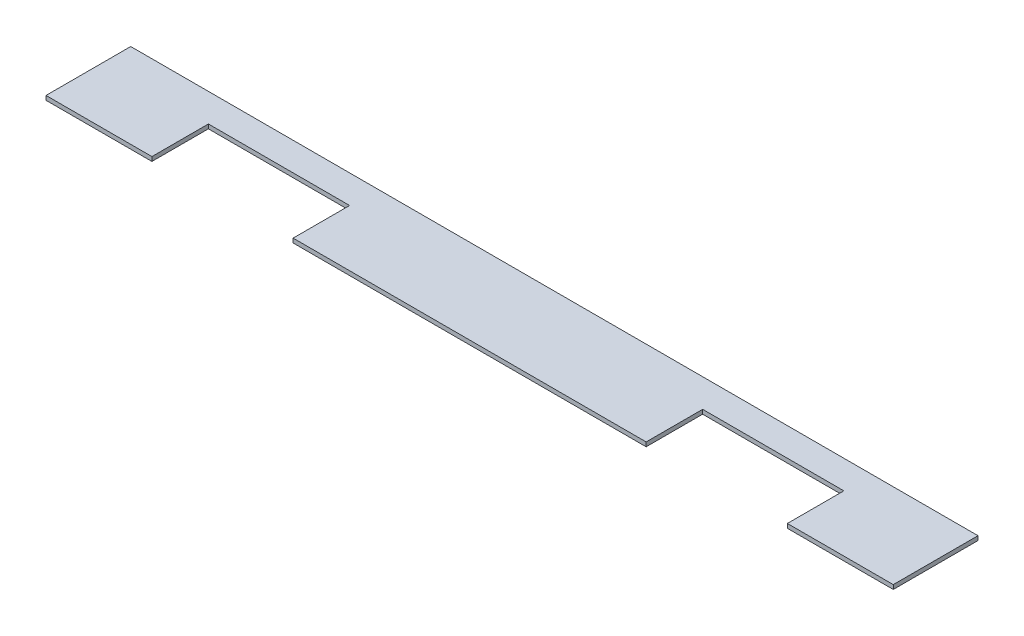
ISO-10303-21;
HEADER;
FILE_DESCRIPTION(('STEP AP214'),'2;1');
FILE_NAME('part.step','',(''),(''),'','','');
FILE_SCHEMA(('AUTOMOTIVE_DESIGN { 1 0 10303 214 1 1 1 1 }'));
ENDSEC;
DATA;
#1=APPLICATION_CONTEXT('core data for automotive mechanical design processes');
#2=APPLICATION_PROTOCOL_DEFINITION('international standard','automotive_design',2000,#1);
#3=PRODUCT_CONTEXT('',#1,'mechanical');
#4=PRODUCT('Part','Part','',(#3));
#5=PRODUCT_RELATED_PRODUCT_CATEGORY('part','',(#4));
#6=PRODUCT_DEFINITION_FORMATION('','',#4);
#7=PRODUCT_DEFINITION_CONTEXT('part definition',#1,'design');
#8=PRODUCT_DEFINITION('design','',#6,#7);
#9=PRODUCT_DEFINITION_SHAPE('','',#8);
#10=(LENGTH_UNIT() NAMED_UNIT(*) SI_UNIT(.MILLI.,.METRE.));
#11=(NAMED_UNIT(*) PLANE_ANGLE_UNIT() SI_UNIT($,.RADIAN.));
#12=(NAMED_UNIT(*) SI_UNIT($,.STERADIAN.) SOLID_ANGLE_UNIT());
#13=UNCERTAINTY_MEASURE_WITH_UNIT(LENGTH_MEASURE(1.E-05),#10,'distance_accuracy_value','');
#14=(GEOMETRIC_REPRESENTATION_CONTEXT(3) GLOBAL_UNCERTAINTY_ASSIGNED_CONTEXT((#13)) GLOBAL_UNIT_ASSIGNED_CONTEXT((#10,
#11,#12)) REPRESENTATION_CONTEXT('',''));
#15=CARTESIAN_POINT('',(0.,0.,0.));
#16=DIRECTION('',(0.,0.,1.));
#17=DIRECTION('',(1.,0.,0.));
#18=AXIS2_PLACEMENT_3D('',#15,#16,#17);
#19=CARTESIAN_POINT('',(-300.,3.,30.));
#20=DIRECTION('',(0.,0.,-1.));
#21=DIRECTION('',(-1.,0.,0.));
#22=AXIS2_PLACEMENT_3D('',#19,#20,#21);
#23=PLANE('',#22);
#24=DIRECTION('',(1.,0.,0.));
#25=VECTOR('',#24,1.);
#26=CARTESIAN_POINT('',(-300.,0.,30.));
#27=LINE('',#26,#25);
#28=CARTESIAN_POINT('',(-300.,0.,30.));
#29=VERTEX_POINT('',#28);
#30=CARTESIAN_POINT('',(-225.,0.,30.));
#31=VERTEX_POINT('',#30);
#32=EDGE_CURVE('E140',#29,#31,#27,.T.);
#33=ORIENTED_EDGE('',*,*,#32,.T.);
#34=DIRECTION('',(0.,1.,0.));
#35=VECTOR('',#34,1.);
#36=CARTESIAN_POINT('',(-225.,-7.,30.));
#37=LINE('',#36,#35);
#38=CARTESIAN_POINT('',(-225.,3.,30.));
#39=VERTEX_POINT('',#38);
#40=EDGE_CURVE('E124',#31,#39,#37,.T.);
#41=ORIENTED_EDGE('',*,*,#40,.T.);
#42=DIRECTION('',(1.,0.,0.));
#43=VECTOR('',#42,1.);
#44=CARTESIAN_POINT('',(-300.,3.,30.));
#45=LINE('',#44,#43);
#46=CARTESIAN_POINT('',(-300.,3.,30.));
#47=VERTEX_POINT('',#46);
#48=EDGE_CURVE('E138',#47,#39,#45,.T.);
#49=ORIENTED_EDGE('',*,*,#48,.F.);
#50=DIRECTION('',(0.,-1.,0.));
#51=VECTOR('',#50,1.);
#52=CARTESIAN_POINT('',(-300.,3.,30.));
#53=LINE('',#52,#51);
#54=EDGE_CURVE('E153',#47,#29,#53,.T.);
#55=ORIENTED_EDGE('',*,*,#54,.T.);
#56=EDGE_LOOP('',(#33,#41,#49,#55));
#57=FACE_BOUND('',#56,.T.);
#58=ADVANCED_FACE('F33',(#57),#23,.F.);
#59=CARTESIAN_POINT('',(-125.,3.,30.));
#60=VERTEX_POINT('',#59);
#61=CARTESIAN_POINT('',(125.,3.,30.));
#62=VERTEX_POINT('',#61);
#63=EDGE_CURVE('E149',#60,#62,#45,.T.);
#64=ORIENTED_EDGE('',*,*,#63,.F.);
#65=DIRECTION('',(0.,1.,0.));
#66=VECTOR('',#65,1.);
#67=CARTESIAN_POINT('',(-125.,-7.,30.));
#68=LINE('',#67,#66);
#69=CARTESIAN_POINT('',(-125.,0.,30.));
#70=VERTEX_POINT('',#69);
#71=EDGE_CURVE('E141',#70,#60,#68,.T.);
#72=ORIENTED_EDGE('',*,*,#71,.F.);
#73=CARTESIAN_POINT('',(125.,0.,30.));
#74=VERTEX_POINT('',#73);
#75=EDGE_CURVE('E200',#70,#74,#27,.T.);
#76=ORIENTED_EDGE('',*,*,#75,.T.);
#77=DIRECTION('',(0.,1.,0.));
#78=VECTOR('',#77,1.);
#79=CARTESIAN_POINT('',(125.,-7.,30.));
#80=LINE('',#79,#78);
#81=EDGE_CURVE('E167',#74,#62,#80,.T.);
#82=ORIENTED_EDGE('',*,*,#81,.T.);
#83=EDGE_LOOP('',(#64,#72,#76,#82));
#84=FACE_BOUND('',#83,.T.);
#85=ADVANCED_FACE('F244',(#84),#23,.F.);
#86=CARTESIAN_POINT('',(300.,3.,-30.));
#87=DIRECTION('',(-1.,0.,0.));
#88=DIRECTION('',(0.,0.,1.));
#89=AXIS2_PLACEMENT_3D('',#86,#87,#88);
#90=PLANE('',#89);
#91=DIRECTION('',(0.,0.,-1.));
#92=VECTOR('',#91,1.);
#93=CARTESIAN_POINT('',(300.,0.,-30.));
#94=LINE('',#93,#92);
#95=CARTESIAN_POINT('',(300.,0.,30.));
#96=VERTEX_POINT('',#95);
#97=CARTESIAN_POINT('',(300.,0.,-30.));
#98=VERTEX_POINT('',#97);
#99=EDGE_CURVE('E184',#96,#98,#94,.T.);
#100=ORIENTED_EDGE('',*,*,#99,.T.);
#101=DIRECTION('',(0.,-1.,0.));
#102=VECTOR('',#101,1.);
#103=CARTESIAN_POINT('',(300.,3.,-30.));
#104=LINE('',#103,#102);
#105=CARTESIAN_POINT('',(300.,3.,-30.));
#106=VERTEX_POINT('',#105);
#107=EDGE_CURVE('E211',#106,#98,#104,.T.);
#108=ORIENTED_EDGE('',*,*,#107,.F.);
#109=DIRECTION('',(0.,0.,-1.));
#110=VECTOR('',#109,1.);
#111=CARTESIAN_POINT('',(300.,3.,-30.));
#112=LINE('',#111,#110);
#113=CARTESIAN_POINT('',(300.,3.,30.));
#114=VERTEX_POINT('',#113);
#115=EDGE_CURVE('E163',#114,#106,#112,.T.);
#116=ORIENTED_EDGE('',*,*,#115,.F.);
#117=DIRECTION('',(0.,-1.,0.));
#118=VECTOR('',#117,1.);
#119=CARTESIAN_POINT('',(300.,3.,30.));
#120=LINE('',#119,#118);
#121=EDGE_CURVE('E148',#114,#96,#120,.T.);
#122=ORIENTED_EDGE('',*,*,#121,.T.);
#123=EDGE_LOOP('',(#100,#108,#116,#122));
#124=FACE_BOUND('',#123,.T.);
#125=ADVANCED_FACE('F35',(#124),#90,.F.);
#126=CARTESIAN_POINT('',(-300.,3.,-30.));
#127=DIRECTION('',(0.,0.,1.));
#128=DIRECTION('',(1.,0.,0.));
#129=AXIS2_PLACEMENT_3D('',#126,#127,#128);
#130=PLANE('',#129);
#131=DIRECTION('',(-1.,0.,0.));
#132=VECTOR('',#131,1.);
#133=CARTESIAN_POINT('',(-300.,0.,-30.));
#134=LINE('',#133,#132);
#135=CARTESIAN_POINT('',(-300.,0.,-30.));
#136=VERTEX_POINT('',#135);
#137=EDGE_CURVE('E222',#98,#136,#134,.T.);
#138=ORIENTED_EDGE('',*,*,#137,.T.);
#139=DIRECTION('',(0.,-1.,0.));
#140=VECTOR('',#139,1.);
#141=CARTESIAN_POINT('',(-300.,3.,-30.));
#142=LINE('',#141,#140);
#143=CARTESIAN_POINT('',(-300.,3.,-30.));
#144=VERTEX_POINT('',#143);
#145=EDGE_CURVE('E214',#144,#136,#142,.T.);
#146=ORIENTED_EDGE('',*,*,#145,.F.);
#147=DIRECTION('',(-1.,0.,0.));
#148=VECTOR('',#147,1.);
#149=CARTESIAN_POINT('',(-300.,3.,-30.));
#150=LINE('',#149,#148);
#151=EDGE_CURVE('E162',#106,#144,#150,.T.);
#152=ORIENTED_EDGE('',*,*,#151,.F.);
#153=ORIENTED_EDGE('',*,*,#107,.T.);
#154=EDGE_LOOP('',(#138,#146,#152,#153));
#155=FACE_BOUND('',#154,.T.);
#156=ADVANCED_FACE('F232',(#155),#130,.F.);
#157=CARTESIAN_POINT('',(-300.,3.,-30.));
#158=DIRECTION('',(1.,0.,0.));
#159=DIRECTION('',(0.,0.,-1.));
#160=AXIS2_PLACEMENT_3D('',#157,#158,#159);
#161=PLANE('',#160);
#162=DIRECTION('',(0.,0.,1.));
#163=VECTOR('',#162,1.);
#164=CARTESIAN_POINT('',(-300.,0.,-30.));
#165=LINE('',#164,#163);
#166=EDGE_CURVE('E220',#136,#29,#165,.T.);
#167=ORIENTED_EDGE('',*,*,#166,.T.);
#168=ORIENTED_EDGE('',*,*,#54,.F.);
#169=DIRECTION('',(0.,0.,1.));
#170=VECTOR('',#169,1.);
#171=CARTESIAN_POINT('',(-300.,3.,-30.));
#172=LINE('',#171,#170);
#173=EDGE_CURVE('E146',#144,#47,#172,.T.);
#174=ORIENTED_EDGE('',*,*,#173,.F.);
#175=ORIENTED_EDGE('',*,*,#145,.T.);
#176=EDGE_LOOP('',(#167,#168,#174,#175));
#177=FACE_BOUND('',#176,.T.);
#178=ADVANCED_FACE('F234',(#177),#161,.F.);
#179=CARTESIAN_POINT('',(225.,3.,30.));
#180=VERTEX_POINT('',#179);
#181=EDGE_CURVE('E151',#180,#114,#45,.T.);
#182=ORIENTED_EDGE('',*,*,#181,.F.);
#183=DIRECTION('',(0.,1.,0.));
#184=VECTOR('',#183,1.);
#185=CARTESIAN_POINT('',(225.,-7.,30.));
#186=LINE('',#185,#184);
#187=CARTESIAN_POINT('',(225.,0.,30.));
#188=VERTEX_POINT('',#187);
#189=EDGE_CURVE('E170',#188,#180,#186,.T.);
#190=ORIENTED_EDGE('',*,*,#189,.F.);
#191=EDGE_CURVE('E219',#188,#96,#27,.T.);
#192=ORIENTED_EDGE('',*,*,#191,.T.);
#193=ORIENTED_EDGE('',*,*,#121,.F.);
#194=EDGE_LOOP('',(#182,#190,#192,#193));
#195=FACE_BOUND('',#194,.T.);
#196=ADVANCED_FACE('F236',(#195),#23,.F.);
#197=CARTESIAN_POINT('',(0.,3.,0.));
#198=DIRECTION('',(0.,1.,0.));
#199=DIRECTION('',(0.,0.,1.));
#200=AXIS2_PLACEMENT_3D('',#197,#198,#199);
#201=PLANE('',#200);
#202=DIRECTION('',(0.,0.,1.));
#203=VECTOR('',#202,1.);
#204=CARTESIAN_POINT('',(-225.,3.,30.));
#205=LINE('',#204,#203);
#206=CARTESIAN_POINT('',(-225.,3.,-9.99999999999997));
#207=VERTEX_POINT('',#206);
#208=EDGE_CURVE('E121',#207,#39,#205,.T.);
#209=ORIENTED_EDGE('',*,*,#208,.F.);
#210=DIRECTION('',(-1.,0.,0.));
#211=VECTOR('',#210,1.);
#212=CARTESIAN_POINT('',(-225.,3.,-9.99999999999997));
#213=LINE('',#212,#211);
#214=CARTESIAN_POINT('',(-125.,3.,-9.99999999999997));
#215=VERTEX_POINT('',#214);
#216=EDGE_CURVE('E142',#215,#207,#213,.T.);
#217=ORIENTED_EDGE('',*,*,#216,.F.);
#218=DIRECTION('',(0.,0.,-1.));
#219=VECTOR('',#218,1.);
#220=CARTESIAN_POINT('',(-125.,3.,30.));
#221=LINE('',#220,#219);
#222=EDGE_CURVE('E131',#60,#215,#221,.T.);
#223=ORIENTED_EDGE('',*,*,#222,.F.);
#224=ORIENTED_EDGE('',*,*,#63,.T.);
#225=DIRECTION('',(0.,0.,1.));
#226=VECTOR('',#225,1.);
#227=CARTESIAN_POINT('',(125.,3.,30.));
#228=LINE('',#227,#226);
#229=CARTESIAN_POINT('',(125.,3.,-9.99999999999997));
#230=VERTEX_POINT('',#229);
#231=EDGE_CURVE('E179',#230,#62,#228,.T.);
#232=ORIENTED_EDGE('',*,*,#231,.F.);
#233=DIRECTION('',(-1.,0.,0.));
#234=VECTOR('',#233,1.);
#235=CARTESIAN_POINT('',(125.,3.,-9.99999999999997));
#236=LINE('',#235,#234);
#237=CARTESIAN_POINT('',(225.,3.,-9.99999999999997));
#238=VERTEX_POINT('',#237);
#239=EDGE_CURVE('E171',#238,#230,#236,.T.);
#240=ORIENTED_EDGE('',*,*,#239,.F.);
#241=DIRECTION('',(0.,0.,-1.));
#242=VECTOR('',#241,1.);
#243=CARTESIAN_POINT('',(225.,3.,30.));
#244=LINE('',#243,#242);
#245=EDGE_CURVE('E177',#180,#238,#244,.T.);
#246=ORIENTED_EDGE('',*,*,#245,.F.);
#247=ORIENTED_EDGE('',*,*,#181,.T.);
#248=ORIENTED_EDGE('',*,*,#115,.T.);
#249=ORIENTED_EDGE('',*,*,#151,.T.);
#250=ORIENTED_EDGE('',*,*,#173,.T.);
#251=ORIENTED_EDGE('',*,*,#48,.T.);
#252=EDGE_LOOP('',(#209,#217,#223,#224,#232,#240,#246,#247,#248,#249,#250,#251));
#253=FACE_BOUND('',#252,.T.);
#254=ADVANCED_FACE('F144',(#253),#201,.T.);
#255=CARTESIAN_POINT('',(0.,0.,0.));
#256=DIRECTION('',(0.,1.,0.));
#257=DIRECTION('',(0.,0.,1.));
#258=AXIS2_PLACEMENT_3D('',#255,#256,#257);
#259=PLANE('',#258);
#260=DIRECTION('',(-1.,0.,0.));
#261=VECTOR('',#260,1.);
#262=CARTESIAN_POINT('',(0.,0.,-9.99999999999997));
#263=LINE('',#262,#261);
#264=CARTESIAN_POINT('',(-125.,0.,-9.99999999999997));
#265=VERTEX_POINT('',#264);
#266=CARTESIAN_POINT('',(-225.,0.,-9.99999999999997));
#267=VERTEX_POINT('',#266);
#268=EDGE_CURVE('E41',#265,#267,#263,.T.);
#269=ORIENTED_EDGE('',*,*,#268,.T.);
#270=DIRECTION('',(0.,0.,1.));
#271=VECTOR('',#270,1.);
#272=CARTESIAN_POINT('',(-225.,0.,0.));
#273=LINE('',#272,#271);
#274=EDGE_CURVE('E11',#267,#31,#273,.T.);
#275=ORIENTED_EDGE('',*,*,#274,.T.);
#276=ORIENTED_EDGE('',*,*,#32,.F.);
#277=ORIENTED_EDGE('',*,*,#166,.F.);
#278=ORIENTED_EDGE('',*,*,#137,.F.);
#279=ORIENTED_EDGE('',*,*,#99,.F.);
#280=ORIENTED_EDGE('',*,*,#191,.F.);
#281=DIRECTION('',(0.,0.,-1.));
#282=VECTOR('',#281,1.);
#283=CARTESIAN_POINT('',(225.,0.,0.));
#284=LINE('',#283,#282);
#285=CARTESIAN_POINT('',(225.,0.,-9.99999999999997));
#286=VERTEX_POINT('',#285);
#287=EDGE_CURVE('E208',#188,#286,#284,.T.);
#288=ORIENTED_EDGE('',*,*,#287,.T.);
#289=DIRECTION('',(-1.,0.,0.));
#290=VECTOR('',#289,1.);
#291=CARTESIAN_POINT('',(0.,0.,-9.99999999999997));
#292=LINE('',#291,#290);
#293=CARTESIAN_POINT('',(125.,0.,-9.99999999999997));
#294=VERTEX_POINT('',#293);
#295=EDGE_CURVE('E203',#286,#294,#292,.T.);
#296=ORIENTED_EDGE('',*,*,#295,.T.);
#297=DIRECTION('',(0.,0.,1.));
#298=VECTOR('',#297,1.);
#299=CARTESIAN_POINT('',(125.,0.,0.));
#300=LINE('',#299,#298);
#301=EDGE_CURVE('E201',#294,#74,#300,.T.);
#302=ORIENTED_EDGE('',*,*,#301,.T.);
#303=ORIENTED_EDGE('',*,*,#75,.F.);
#304=DIRECTION('',(0.,0.,-1.));
#305=VECTOR('',#304,1.);
#306=CARTESIAN_POINT('',(-125.,0.,0.));
#307=LINE('',#306,#305);
#308=EDGE_CURVE('E195',#70,#265,#307,.T.);
#309=ORIENTED_EDGE('',*,*,#308,.T.);
#310=EDGE_LOOP('',(#269,#275,#276,#277,#278,#279,#280,#288,#296,#302,#303,#309));
#311=FACE_BOUND('',#310,.T.);
#312=ADVANCED_FACE('F197',(#311),#259,.F.);
#313=CARTESIAN_POINT('',(125.,-7.,30.));
#314=DIRECTION('',(-1.,0.,0.));
#315=DIRECTION('',(0.,0.,1.));
#316=AXIS2_PLACEMENT_3D('',#313,#314,#315);
#317=PLANE('',#316);
#318=DIRECTION('',(0.,1.,0.));
#319=VECTOR('',#318,1.);
#320=CARTESIAN_POINT('',(125.,-7.,-9.99999999999997));
#321=LINE('',#320,#319);
#322=EDGE_CURVE('E132',#294,#230,#321,.T.);
#323=ORIENTED_EDGE('',*,*,#322,.T.);
#324=ORIENTED_EDGE('',*,*,#231,.T.);
#325=ORIENTED_EDGE('',*,*,#81,.F.);
#326=ORIENTED_EDGE('',*,*,#301,.F.);
#327=EDGE_LOOP('',(#323,#324,#325,#326));
#328=FACE_BOUND('',#327,.T.);
#329=ADVANCED_FACE('F253',(#328),#317,.F.);
#330=CARTESIAN_POINT('',(125.,-7.,-9.99999999999997));
#331=DIRECTION('',(0.,0.,-1.));
#332=DIRECTION('',(-1.,0.,0.));
#333=AXIS2_PLACEMENT_3D('',#330,#331,#332);
#334=PLANE('',#333);
#335=DIRECTION('',(0.,1.,0.));
#336=VECTOR('',#335,1.);
#337=CARTESIAN_POINT('',(225.,-7.,-9.99999999999997));
#338=LINE('',#337,#336);
#339=EDGE_CURVE('E56',#286,#238,#338,.T.);
#340=ORIENTED_EDGE('',*,*,#339,.T.);
#341=ORIENTED_EDGE('',*,*,#239,.T.);
#342=ORIENTED_EDGE('',*,*,#322,.F.);
#343=ORIENTED_EDGE('',*,*,#295,.F.);
#344=EDGE_LOOP('',(#340,#341,#342,#343));
#345=FACE_BOUND('',#344,.T.);
#346=ADVANCED_FACE('F258',(#345),#334,.F.);
#347=CARTESIAN_POINT('',(225.,-7.,30.));
#348=DIRECTION('',(1.,0.,0.));
#349=DIRECTION('',(0.,0.,-1.));
#350=AXIS2_PLACEMENT_3D('',#347,#348,#349);
#351=PLANE('',#350);
#352=ORIENTED_EDGE('',*,*,#189,.T.);
#353=ORIENTED_EDGE('',*,*,#245,.T.);
#354=ORIENTED_EDGE('',*,*,#339,.F.);
#355=ORIENTED_EDGE('',*,*,#287,.F.);
#356=EDGE_LOOP('',(#352,#353,#354,#355));
#357=FACE_BOUND('',#356,.T.);
#358=ADVANCED_FACE('F260',(#357),#351,.F.);
#359=CARTESIAN_POINT('',(-225.,-7.,30.));
#360=DIRECTION('',(-1.,0.,0.));
#361=DIRECTION('',(0.,0.,1.));
#362=AXIS2_PLACEMENT_3D('',#359,#360,#361);
#363=PLANE('',#362);
#364=DIRECTION('',(0.,1.,0.));
#365=VECTOR('',#364,1.);
#366=CARTESIAN_POINT('',(-225.,-7.,-9.99999999999997));
#367=LINE('',#366,#365);
#368=EDGE_CURVE('E126',#267,#207,#367,.T.);
#369=ORIENTED_EDGE('',*,*,#368,.T.);
#370=ORIENTED_EDGE('',*,*,#208,.T.);
#371=ORIENTED_EDGE('',*,*,#40,.F.);
#372=ORIENTED_EDGE('',*,*,#274,.F.);
#373=EDGE_LOOP('',(#369,#370,#371,#372));
#374=FACE_BOUND('',#373,.T.);
#375=ADVANCED_FACE('F123',(#374),#363,.F.);
#376=CARTESIAN_POINT('',(-225.,-7.,-9.99999999999997));
#377=DIRECTION('',(0.,0.,-1.));
#378=DIRECTION('',(-1.,0.,0.));
#379=AXIS2_PLACEMENT_3D('',#376,#377,#378);
#380=PLANE('',#379);
#381=DIRECTION('',(0.,1.,0.));
#382=VECTOR('',#381,1.);
#383=CARTESIAN_POINT('',(-125.,-7.,-9.99999999999997));
#384=LINE('',#383,#382);
#385=EDGE_CURVE('E48',#265,#215,#384,.T.);
#386=ORIENTED_EDGE('',*,*,#385,.T.);
#387=ORIENTED_EDGE('',*,*,#216,.T.);
#388=ORIENTED_EDGE('',*,*,#368,.F.);
#389=ORIENTED_EDGE('',*,*,#268,.F.);
#390=EDGE_LOOP('',(#386,#387,#388,#389));
#391=FACE_BOUND('',#390,.T.);
#392=ADVANCED_FACE('F191',(#391),#380,.F.);
#393=CARTESIAN_POINT('',(-125.,-7.,30.));
#394=DIRECTION('',(1.,0.,0.));
#395=DIRECTION('',(0.,0.,-1.));
#396=AXIS2_PLACEMENT_3D('',#393,#394,#395);
#397=PLANE('',#396);
#398=ORIENTED_EDGE('',*,*,#71,.T.);
#399=ORIENTED_EDGE('',*,*,#222,.T.);
#400=ORIENTED_EDGE('',*,*,#385,.F.);
#401=ORIENTED_EDGE('',*,*,#308,.F.);
#402=EDGE_LOOP('',(#398,#399,#400,#401));
#403=FACE_BOUND('',#402,.T.);
#404=ADVANCED_FACE('F187',(#403),#397,.F.);
#405=CLOSED_SHELL('',(#58,#85,#125,#156,#178,#196,#254,#312,#329,#346,#358,#375,#392,#404));
#406=MANIFOLD_SOLID_BREP('B2',#405);
#407=ADVANCED_BREP_SHAPE_REPRESENTATION('',(#18,#406),#14);
#408=SHAPE_DEFINITION_REPRESENTATION(#9,#407);
ENDSEC;
END-ISO-10303-21;
